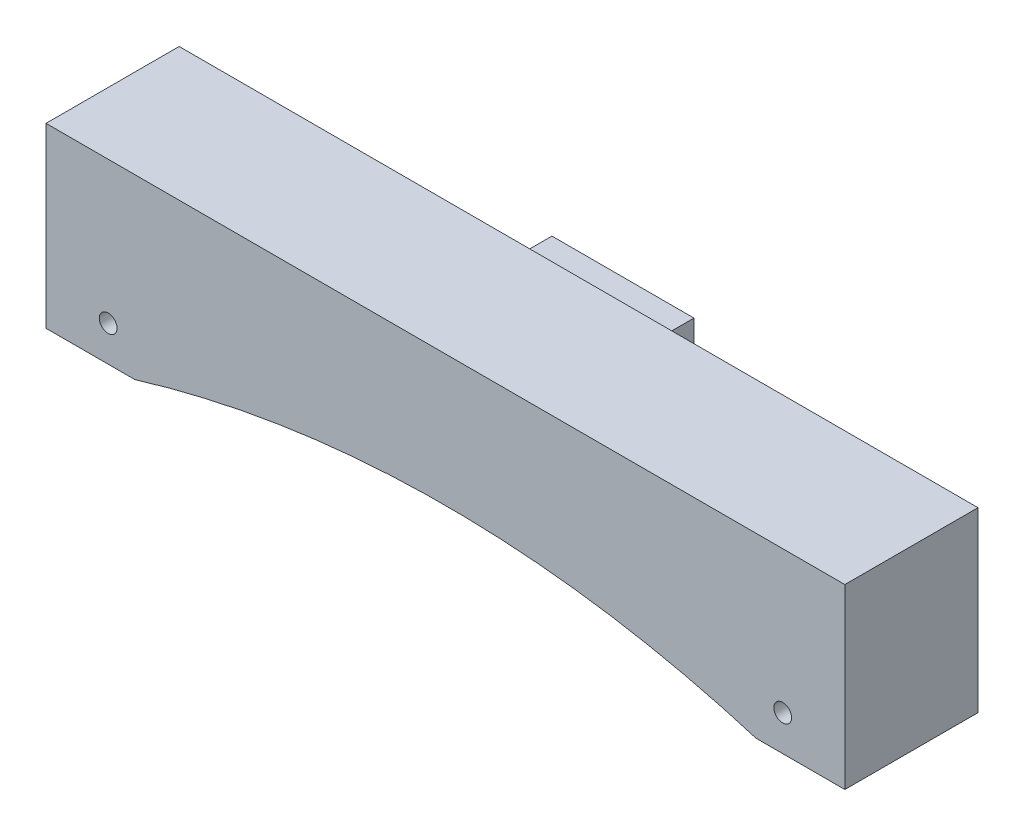
ISO-10303-21;
HEADER;
FILE_DESCRIPTION(('STEP AP214'),'2;1');
FILE_NAME('part.step','',(''),(''),'','','');
FILE_SCHEMA(('AUTOMOTIVE_DESIGN { 1 0 10303 214 1 1 1 1 }'));
ENDSEC;
DATA;
#1=APPLICATION_CONTEXT('core data for automotive mechanical design processes');
#2=APPLICATION_PROTOCOL_DEFINITION('international standard','automotive_design',2000,#1);
#3=PRODUCT_CONTEXT('',#1,'mechanical');
#4=PRODUCT('Part','Part','',(#3));
#5=PRODUCT_RELATED_PRODUCT_CATEGORY('part','',(#4));
#6=PRODUCT_DEFINITION_FORMATION('','',#4);
#7=PRODUCT_DEFINITION_CONTEXT('part definition',#1,'design');
#8=PRODUCT_DEFINITION('design','',#6,#7);
#9=PRODUCT_DEFINITION_SHAPE('','',#8);
#10=(LENGTH_UNIT() NAMED_UNIT(*) SI_UNIT(.MILLI.,.METRE.));
#11=(NAMED_UNIT(*) PLANE_ANGLE_UNIT() SI_UNIT($,.RADIAN.));
#12=(NAMED_UNIT(*) SI_UNIT($,.STERADIAN.) SOLID_ANGLE_UNIT());
#13=UNCERTAINTY_MEASURE_WITH_UNIT(LENGTH_MEASURE(1.E-05),#10,'distance_accuracy_value','');
#14=(GEOMETRIC_REPRESENTATION_CONTEXT(3) GLOBAL_UNCERTAINTY_ASSIGNED_CONTEXT((#13)) GLOBAL_UNIT_ASSIGNED_CONTEXT((#10,
#11,#12)) REPRESENTATION_CONTEXT('',''));
#15=CARTESIAN_POINT('',(0.,0.,0.));
#16=DIRECTION('',(0.,0.,1.));
#17=DIRECTION('',(1.,0.,0.));
#18=AXIS2_PLACEMENT_3D('',#15,#16,#17);
#19=CARTESIAN_POINT('',(45.,-134.78240283249,0.));
#20=DIRECTION('',(0.,0.,1.));
#21=DIRECTION('',(1.,0.,0.));
#22=AXIS2_PLACEMENT_3D('',#19,#20,#21);
#23=PLANE('',#22);
#24=DIRECTION('',(0.,-1.,0.));
#25=VECTOR('',#24,1.);
#26=CARTESIAN_POINT('',(0.,0.,0.));
#27=LINE('',#26,#25);
#28=CARTESIAN_POINT('',(0.,0.,0.));
#29=VERTEX_POINT('',#28);
#30=CARTESIAN_POINT('',(0.,-20.,0.));
#31=VERTEX_POINT('',#30);
#32=EDGE_CURVE('E243',#29,#31,#27,.T.);
#33=ORIENTED_EDGE('',*,*,#32,.F.);
#34=DIRECTION('',(-1.,0.,0.));
#35=VECTOR('',#34,1.);
#36=CARTESIAN_POINT('',(0.,0.,0.));
#37=LINE('',#36,#35);
#38=CARTESIAN_POINT('',(90.,0.,0.));
#39=VERTEX_POINT('',#38);
#40=EDGE_CURVE('E260',#39,#29,#37,.T.);
#41=ORIENTED_EDGE('',*,*,#40,.F.);
#42=DIRECTION('',(0.,1.,0.));
#43=VECTOR('',#42,1.);
#44=CARTESIAN_POINT('',(90.,0.,0.));
#45=LINE('',#44,#43);
#46=CARTESIAN_POINT('',(90.,-20.,0.));
#47=VERTEX_POINT('',#46);
#48=EDGE_CURVE('E288',#47,#39,#45,.T.);
#49=ORIENTED_EDGE('',*,*,#48,.F.);
#50=DIRECTION('',(1.,0.,0.));
#51=VECTOR('',#50,1.);
#52=CARTESIAN_POINT('',(90.,-20.,0.));
#53=LINE('',#52,#51);
#54=CARTESIAN_POINT('',(80.,-20.,0.));
#55=VERTEX_POINT('',#54);
#56=EDGE_CURVE('E285',#55,#47,#53,.T.);
#57=ORIENTED_EDGE('',*,*,#56,.F.);
#58=CARTESIAN_POINT('',(45.,-134.78240283249,0.));
#59=DIRECTION('',(0.,0.,-1.));
#60=DIRECTION('',(1.,0.,0.));
#61=AXIS2_PLACEMENT_3D('',#58,#59,#60);
#62=CIRCLE('',#61,120.);
#63=CARTESIAN_POINT('',(10.,-20.,0.));
#64=VERTEX_POINT('',#63);
#65=EDGE_CURVE('E282',#64,#55,#62,.T.);
#66=ORIENTED_EDGE('',*,*,#65,.F.);
#67=DIRECTION('',(1.,0.,0.));
#68=VECTOR('',#67,1.);
#69=CARTESIAN_POINT('',(0.,-20.,0.));
#70=LINE('',#69,#68);
#71=EDGE_CURVE('E279',#31,#64,#70,.T.);
#72=ORIENTED_EDGE('',*,*,#71,.F.);
#73=EDGE_LOOP('',(#33,#41,#49,#57,#66,#72));
#74=FACE_BOUND('',#73,.T.);
#75=DIRECTION('',(0.,1.,0.));
#76=VECTOR('',#75,1.);
#77=CARTESIAN_POINT('',(37.,-11.5,0.));
#78=LINE('',#77,#76);
#79=CARTESIAN_POINT('',(37.,-11.5,0.));
#80=VERTEX_POINT('',#79);
#81=CARTESIAN_POINT('',(37.,-2.5,0.));
#82=VERTEX_POINT('',#81);
#83=EDGE_CURVE('E57',#80,#82,#78,.T.);
#84=ORIENTED_EDGE('',*,*,#83,.F.);
#85=DIRECTION('',(-1.,0.,0.));
#86=VECTOR('',#85,1.);
#87=CARTESIAN_POINT('',(53.,-11.5,0.));
#88=LINE('',#87,#86);
#89=CARTESIAN_POINT('',(53.,-11.5,0.));
#90=VERTEX_POINT('',#89);
#91=EDGE_CURVE('E61',#90,#80,#88,.T.);
#92=ORIENTED_EDGE('',*,*,#91,.F.);
#93=DIRECTION('',(0.,-1.,0.));
#94=VECTOR('',#93,1.);
#95=CARTESIAN_POINT('',(53.,-11.5,0.));
#96=LINE('',#95,#94);
#97=CARTESIAN_POINT('',(53.,-2.5,0.));
#98=VERTEX_POINT('',#97);
#99=EDGE_CURVE('E218',#98,#90,#96,.T.);
#100=ORIENTED_EDGE('',*,*,#99,.F.);
#101=DIRECTION('',(1.,0.,0.));
#102=VECTOR('',#101,1.);
#103=CARTESIAN_POINT('',(53.,-2.5,0.));
#104=LINE('',#103,#102);
#105=EDGE_CURVE('E214',#82,#98,#104,.T.);
#106=ORIENTED_EDGE('',*,*,#105,.F.);
#107=EDGE_LOOP('',(#84,#92,#100,#106));
#108=FACE_BOUND('',#107,.T.);
#109=ADVANCED_FACE('F41',(#74,#108),#23,.F.);
#110=CARTESIAN_POINT('',(0.,0.,15.));
#111=DIRECTION('',(1.,0.,0.));
#112=DIRECTION('',(0.,1.,0.));
#113=AXIS2_PLACEMENT_3D('',#110,#111,#112);
#114=PLANE('',#113);
#115=ORIENTED_EDGE('',*,*,#32,.T.);
#116=DIRECTION('',(0.,0.,-1.));
#117=VECTOR('',#116,1.);
#118=CARTESIAN_POINT('',(0.,-20.,15.));
#119=LINE('',#118,#117);
#120=CARTESIAN_POINT('',(0.,-20.,15.));
#121=VERTEX_POINT('',#120);
#122=EDGE_CURVE('E11',#121,#31,#119,.T.);
#123=ORIENTED_EDGE('',*,*,#122,.F.);
#124=DIRECTION('',(0.,-1.,0.));
#125=VECTOR('',#124,1.);
#126=CARTESIAN_POINT('',(0.,0.,15.));
#127=LINE('',#126,#125);
#128=CARTESIAN_POINT('',(0.,0.,15.));
#129=VERTEX_POINT('',#128);
#130=EDGE_CURVE('E255',#129,#121,#127,.T.);
#131=ORIENTED_EDGE('',*,*,#130,.F.);
#132=DIRECTION('',(0.,0.,-1.));
#133=VECTOR('',#132,1.);
#134=CARTESIAN_POINT('',(0.,0.,15.));
#135=LINE('',#134,#133);
#136=EDGE_CURVE('E275',#129,#29,#135,.T.);
#137=ORIENTED_EDGE('',*,*,#136,.T.);
#138=EDGE_LOOP('',(#115,#123,#131,#137));
#139=FACE_BOUND('',#138,.T.);
#140=ADVANCED_FACE('F43',(#139),#114,.F.);
#141=CARTESIAN_POINT('',(0.,-20.,15.));
#142=DIRECTION('',(0.,1.,0.));
#143=DIRECTION('',(0.,0.,1.));
#144=AXIS2_PLACEMENT_3D('',#141,#142,#143);
#145=PLANE('',#144);
#146=ORIENTED_EDGE('',*,*,#71,.T.);
#147=DIRECTION('',(0.,0.,-1.));
#148=VECTOR('',#147,1.);
#149=CARTESIAN_POINT('',(10.,-20.,15.));
#150=LINE('',#149,#148);
#151=CARTESIAN_POINT('',(10.,-20.,15.));
#152=VERTEX_POINT('',#151);
#153=EDGE_CURVE('E50',#152,#64,#150,.T.);
#154=ORIENTED_EDGE('',*,*,#153,.F.);
#155=DIRECTION('',(1.,0.,0.));
#156=VECTOR('',#155,1.);
#157=CARTESIAN_POINT('',(0.,-20.,15.));
#158=LINE('',#157,#156);
#159=EDGE_CURVE('E259',#121,#152,#158,.T.);
#160=ORIENTED_EDGE('',*,*,#159,.F.);
#161=ORIENTED_EDGE('',*,*,#122,.T.);
#162=EDGE_LOOP('',(#146,#154,#160,#161));
#163=FACE_BOUND('',#162,.T.);
#164=ADVANCED_FACE('F335',(#163),#145,.F.);
#165=CARTESIAN_POINT('',(45.,-134.78240283249,15.));
#166=DIRECTION('',(0.,0.,-1.));
#167=DIRECTION('',(-1.,0.,0.));
#168=AXIS2_PLACEMENT_3D('',#165,#166,#167);
#169=CYLINDRICAL_SURFACE('',#168,120.);
#170=ORIENTED_EDGE('',*,*,#65,.T.);
#171=DIRECTION('',(0.,0.,-1.));
#172=VECTOR('',#171,1.);
#173=CARTESIAN_POINT('',(80.,-20.,15.));
#174=LINE('',#173,#172);
#175=CARTESIAN_POINT('',(80.,-20.,15.));
#176=VERTEX_POINT('',#175);
#177=EDGE_CURVE('E304',#176,#55,#174,.T.);
#178=ORIENTED_EDGE('',*,*,#177,.F.);
#179=CARTESIAN_POINT('',(45.,-134.78240283249,15.));
#180=DIRECTION('',(0.,0.,-1.));
#181=DIRECTION('',(1.,0.,0.));
#182=AXIS2_PLACEMENT_3D('',#179,#180,#181);
#183=CIRCLE('',#182,120.);
#184=EDGE_CURVE('E263',#152,#176,#183,.T.);
#185=ORIENTED_EDGE('',*,*,#184,.F.);
#186=ORIENTED_EDGE('',*,*,#153,.T.);
#187=EDGE_LOOP('',(#170,#178,#185,#186));
#188=FACE_BOUND('',#187,.T.);
#189=ADVANCED_FACE('F313',(#188),#169,.F.);
#190=CARTESIAN_POINT('',(90.,-20.,15.));
#191=DIRECTION('',(0.,1.,0.));
#192=DIRECTION('',(-1.,0.,0.));
#193=AXIS2_PLACEMENT_3D('',#190,#191,#192);
#194=PLANE('',#193);
#195=ORIENTED_EDGE('',*,*,#56,.T.);
#196=DIRECTION('',(0.,0.,-1.));
#197=VECTOR('',#196,1.);
#198=CARTESIAN_POINT('',(90.,-20.,15.));
#199=LINE('',#198,#197);
#200=CARTESIAN_POINT('',(90.,-20.,15.));
#201=VERTEX_POINT('',#200);
#202=EDGE_CURVE('E300',#201,#47,#199,.T.);
#203=ORIENTED_EDGE('',*,*,#202,.F.);
#204=DIRECTION('',(1.,0.,0.));
#205=VECTOR('',#204,1.);
#206=CARTESIAN_POINT('',(90.,-20.,15.));
#207=LINE('',#206,#205);
#208=EDGE_CURVE('E266',#176,#201,#207,.T.);
#209=ORIENTED_EDGE('',*,*,#208,.F.);
#210=ORIENTED_EDGE('',*,*,#177,.T.);
#211=EDGE_LOOP('',(#195,#203,#209,#210));
#212=FACE_BOUND('',#211,.T.);
#213=ADVANCED_FACE('F323',(#212),#194,.F.);
#214=CARTESIAN_POINT('',(90.,0.,15.));
#215=DIRECTION('',(-1.,0.,0.));
#216=DIRECTION('',(0.,0.,1.));
#217=AXIS2_PLACEMENT_3D('',#214,#215,#216);
#218=PLANE('',#217);
#219=ORIENTED_EDGE('',*,*,#48,.T.);
#220=DIRECTION('',(0.,0.,-1.));
#221=VECTOR('',#220,1.);
#222=CARTESIAN_POINT('',(90.,0.,15.));
#223=LINE('',#222,#221);
#224=CARTESIAN_POINT('',(90.,0.,15.));
#225=VERTEX_POINT('',#224);
#226=EDGE_CURVE('E296',#225,#39,#223,.T.);
#227=ORIENTED_EDGE('',*,*,#226,.F.);
#228=DIRECTION('',(0.,1.,0.));
#229=VECTOR('',#228,1.);
#230=CARTESIAN_POINT('',(90.,0.,15.));
#231=LINE('',#230,#229);
#232=EDGE_CURVE('E269',#201,#225,#231,.T.);
#233=ORIENTED_EDGE('',*,*,#232,.F.);
#234=ORIENTED_EDGE('',*,*,#202,.T.);
#235=EDGE_LOOP('',(#219,#227,#233,#234));
#236=FACE_BOUND('',#235,.T.);
#237=ADVANCED_FACE('F327',(#236),#218,.F.);
#238=CARTESIAN_POINT('',(0.,0.,15.));
#239=DIRECTION('',(0.,-1.,0.));
#240=DIRECTION('',(0.,0.,-1.));
#241=AXIS2_PLACEMENT_3D('',#238,#239,#240);
#242=PLANE('',#241);
#243=ORIENTED_EDGE('',*,*,#40,.T.);
#244=ORIENTED_EDGE('',*,*,#136,.F.);
#245=DIRECTION('',(-1.,0.,0.));
#246=VECTOR('',#245,1.);
#247=CARTESIAN_POINT('',(0.,0.,15.));
#248=LINE('',#247,#246);
#249=EDGE_CURVE('E272',#225,#129,#248,.T.);
#250=ORIENTED_EDGE('',*,*,#249,.F.);
#251=ORIENTED_EDGE('',*,*,#226,.T.);
#252=EDGE_LOOP('',(#243,#244,#250,#251));
#253=FACE_BOUND('',#252,.T.);
#254=ADVANCED_FACE('F338',(#253),#242,.F.);
#255=CARTESIAN_POINT('',(45.,-134.78240283249,15.));
#256=DIRECTION('',(0.,0.,1.));
#257=DIRECTION('',(1.,0.,0.));
#258=AXIS2_PLACEMENT_3D('',#255,#256,#257);
#259=PLANE('',#258);
#260=CARTESIAN_POINT('',(7.,-16.,15.));
#261=DIRECTION('',(0.,0.,1.));
#262=DIRECTION('',(1.,0.,0.));
#263=AXIS2_PLACEMENT_3D('',#260,#261,#262);
#264=CIRCLE('',#263,1.);
#265=CARTESIAN_POINT('',(8.,-16.,15.));
#266=VERTEX_POINT('',#265);
#267=EDGE_CURVE('E244',#266,#266,#264,.T.);
#268=ORIENTED_EDGE('',*,*,#267,.F.);
#269=EDGE_LOOP('',(#268));
#270=FACE_BOUND('',#269,.T.);
#271=CARTESIAN_POINT('',(83.,-16.,15.));
#272=DIRECTION('',(0.,0.,1.));
#273=DIRECTION('',(1.,0.,0.));
#274=AXIS2_PLACEMENT_3D('',#271,#272,#273);
#275=CIRCLE('',#274,0.999999999999998);
#276=CARTESIAN_POINT('',(84.,-16.,15.));
#277=VERTEX_POINT('',#276);
#278=EDGE_CURVE('E238',#277,#277,#275,.T.);
#279=ORIENTED_EDGE('',*,*,#278,.F.);
#280=EDGE_LOOP('',(#279));
#281=FACE_BOUND('',#280,.T.);
#282=ORIENTED_EDGE('',*,*,#130,.T.);
#283=ORIENTED_EDGE('',*,*,#159,.T.);
#284=ORIENTED_EDGE('',*,*,#184,.T.);
#285=ORIENTED_EDGE('',*,*,#208,.T.);
#286=ORIENTED_EDGE('',*,*,#232,.T.);
#287=ORIENTED_EDGE('',*,*,#249,.T.);
#288=EDGE_LOOP('',(#282,#283,#284,#285,#286,#287));
#289=FACE_BOUND('',#288,.T.);
#290=ADVANCED_FACE('F331',(#270,#281,#289),#259,.T.);
#291=CARTESIAN_POINT('',(83.,-16.,10.));
#292=DIRECTION('',(0.,0.,1.));
#293=DIRECTION('',(1.,0.,0.));
#294=AXIS2_PLACEMENT_3D('',#291,#292,#293);
#295=CYLINDRICAL_SURFACE('',#294,0.999999999999998);
#296=CARTESIAN_POINT('',(83.,-16.,10.));
#297=DIRECTION('',(0.,0.,1.));
#298=DIRECTION('',(1.,0.,0.));
#299=AXIS2_PLACEMENT_3D('',#296,#297,#298);
#300=CIRCLE('',#299,0.999999999999998);
#301=CARTESIAN_POINT('',(84.,-16.,10.));
#302=VERTEX_POINT('',#301);
#303=EDGE_CURVE('E248',#302,#302,#300,.T.);
#304=ORIENTED_EDGE('',*,*,#303,.F.);
#305=EDGE_LOOP('',(#304));
#306=FACE_BOUND('',#305,.T.);
#307=ORIENTED_EDGE('',*,*,#278,.T.);
#308=EDGE_LOOP('',(#307));
#309=FACE_BOUND('',#308,.T.);
#310=ADVANCED_FACE('F345',(#306,#309),#295,.F.);
#311=CARTESIAN_POINT('',(83.,-16.,10.));
#312=DIRECTION('',(0.,0.,1.));
#313=DIRECTION('',(1.,0.,0.));
#314=AXIS2_PLACEMENT_3D('',#311,#312,#313);
#315=PLANE('',#314);
#316=ORIENTED_EDGE('',*,*,#303,.T.);
#317=EDGE_LOOP('',(#316));
#318=FACE_BOUND('',#317,.T.);
#319=ADVANCED_FACE('F410',(#318),#315,.T.);
#320=CARTESIAN_POINT('',(7.,-16.,10.));
#321=DIRECTION('',(0.,0.,1.));
#322=DIRECTION('',(1.,0.,0.));
#323=AXIS2_PLACEMENT_3D('',#320,#321,#322);
#324=CYLINDRICAL_SURFACE('',#323,1.);
#325=CARTESIAN_POINT('',(7.,-16.,10.));
#326=DIRECTION('',(0.,0.,1.));
#327=DIRECTION('',(1.,0.,0.));
#328=AXIS2_PLACEMENT_3D('',#325,#326,#327);
#329=CIRCLE('',#328,1.);
#330=CARTESIAN_POINT('',(8.,-16.,10.));
#331=VERTEX_POINT('',#330);
#332=EDGE_CURVE('E239',#331,#331,#329,.T.);
#333=ORIENTED_EDGE('',*,*,#332,.F.);
#334=EDGE_LOOP('',(#333));
#335=FACE_BOUND('',#334,.T.);
#336=ORIENTED_EDGE('',*,*,#267,.T.);
#337=EDGE_LOOP('',(#336));
#338=FACE_BOUND('',#337,.T.);
#339=ADVANCED_FACE('F406',(#335,#338),#324,.F.);
#340=CARTESIAN_POINT('',(7.,-16.,10.));
#341=DIRECTION('',(0.,0.,1.));
#342=DIRECTION('',(1.,0.,0.));
#343=AXIS2_PLACEMENT_3D('',#340,#341,#342);
#344=PLANE('',#343);
#345=ORIENTED_EDGE('',*,*,#332,.T.);
#346=EDGE_LOOP('',(#345));
#347=FACE_BOUND('',#346,.T.);
#348=ADVANCED_FACE('F388',(#347),#344,.T.);
#349=CARTESIAN_POINT('',(0.,0.,-5.));
#350=DIRECTION('',(0.,0.,1.));
#351=DIRECTION('',(1.,0.,0.));
#352=AXIS2_PLACEMENT_3D('',#349,#350,#351);
#353=PLANE('',#352);
#354=DIRECTION('',(0.,1.,0.));
#355=VECTOR('',#354,1.);
#356=CARTESIAN_POINT('',(37.,-11.5,-5.));
#357=LINE('',#356,#355);
#358=CARTESIAN_POINT('',(37.,-11.5,-5.));
#359=VERTEX_POINT('',#358);
#360=CARTESIAN_POINT('',(37.,-2.5,-5.));
#361=VERTEX_POINT('',#360);
#362=EDGE_CURVE('E198',#359,#361,#357,.T.);
#363=ORIENTED_EDGE('',*,*,#362,.T.);
#364=DIRECTION('',(1.,0.,0.));
#365=VECTOR('',#364,1.);
#366=CARTESIAN_POINT('',(53.,-2.5,-5.));
#367=LINE('',#366,#365);
#368=CARTESIAN_POINT('',(53.,-2.5,-5.));
#369=VERTEX_POINT('',#368);
#370=EDGE_CURVE('E202',#361,#369,#367,.T.);
#371=ORIENTED_EDGE('',*,*,#370,.T.);
#372=DIRECTION('',(0.,-1.,0.));
#373=VECTOR('',#372,1.);
#374=CARTESIAN_POINT('',(53.,-11.5,-5.));
#375=LINE('',#374,#373);
#376=CARTESIAN_POINT('',(53.,-11.5,-5.));
#377=VERTEX_POINT('',#376);
#378=EDGE_CURVE('E205',#369,#377,#375,.T.);
#379=ORIENTED_EDGE('',*,*,#378,.T.);
#380=DIRECTION('',(-1.,0.,0.));
#381=VECTOR('',#380,1.);
#382=CARTESIAN_POINT('',(53.,-11.5,-5.));
#383=LINE('',#382,#381);
#384=EDGE_CURVE('E208',#377,#359,#383,.T.);
#385=ORIENTED_EDGE('',*,*,#384,.T.);
#386=EDGE_LOOP('',(#363,#371,#379,#385));
#387=FACE_BOUND('',#386,.T.);
#388=DIRECTION('',(0.,1.,0.));
#389=VECTOR('',#388,1.);
#390=CARTESIAN_POINT('',(37.5,-3.,-5.));
#391=LINE('',#390,#389);
#392=CARTESIAN_POINT('',(37.5,-11.,-5.));
#393=VERTEX_POINT('',#392);
#394=CARTESIAN_POINT('',(37.5,-3.,-5.));
#395=VERTEX_POINT('',#394);
#396=EDGE_CURVE('E142',#393,#395,#391,.T.);
#397=ORIENTED_EDGE('',*,*,#396,.F.);
#398=DIRECTION('',(-1.,0.,0.));
#399=VECTOR('',#398,1.);
#400=CARTESIAN_POINT('',(52.5,-11.,-5.));
#401=LINE('',#400,#399);
#402=CARTESIAN_POINT('',(52.5,-11.,-5.));
#403=VERTEX_POINT('',#402);
#404=EDGE_CURVE('E171',#403,#393,#401,.T.);
#405=ORIENTED_EDGE('',*,*,#404,.F.);
#406=DIRECTION('',(0.,-1.,0.));
#407=VECTOR('',#406,1.);
#408=CARTESIAN_POINT('',(52.5,-3.,-5.));
#409=LINE('',#408,#407);
#410=CARTESIAN_POINT('',(52.5,-3.,-5.));
#411=VERTEX_POINT('',#410);
#412=EDGE_CURVE('E167',#411,#403,#409,.T.);
#413=ORIENTED_EDGE('',*,*,#412,.F.);
#414=DIRECTION('',(1.,0.,0.));
#415=VECTOR('',#414,1.);
#416=CARTESIAN_POINT('',(52.5,-3.,-5.));
#417=LINE('',#416,#415);
#418=EDGE_CURVE('E153',#395,#411,#417,.T.);
#419=ORIENTED_EDGE('',*,*,#418,.F.);
#420=EDGE_LOOP('',(#397,#405,#413,#419));
#421=FACE_BOUND('',#420,.T.);
#422=ADVANCED_FACE('F165',(#387,#421),#353,.F.);
#423=CARTESIAN_POINT('',(37.,-11.5,-5.));
#424=DIRECTION('',(1.,0.,0.));
#425=DIRECTION('',(0.,1.,0.));
#426=AXIS2_PLACEMENT_3D('',#423,#424,#425);
#427=PLANE('',#426);
#428=ORIENTED_EDGE('',*,*,#83,.T.);
#429=DIRECTION('',(0.,0.,1.));
#430=VECTOR('',#429,1.);
#431=CARTESIAN_POINT('',(37.,-2.5,-5.));
#432=LINE('',#431,#430);
#433=EDGE_CURVE('E234',#361,#82,#432,.T.);
#434=ORIENTED_EDGE('',*,*,#433,.F.);
#435=ORIENTED_EDGE('',*,*,#362,.F.);
#436=DIRECTION('',(0.,0.,1.));
#437=VECTOR('',#436,1.);
#438=CARTESIAN_POINT('',(37.,-11.5,-5.));
#439=LINE('',#438,#437);
#440=EDGE_CURVE('E211',#359,#80,#439,.T.);
#441=ORIENTED_EDGE('',*,*,#440,.T.);
#442=EDGE_LOOP('',(#428,#434,#435,#441));
#443=FACE_BOUND('',#442,.T.);
#444=ADVANCED_FACE('F387',(#443),#427,.F.);
#445=CARTESIAN_POINT('',(53.,-2.5,-5.));
#446=DIRECTION('',(0.,-1.,0.));
#447=DIRECTION('',(0.,0.,-1.));
#448=AXIS2_PLACEMENT_3D('',#445,#446,#447);
#449=PLANE('',#448);
#450=ORIENTED_EDGE('',*,*,#105,.T.);
#451=DIRECTION('',(0.,0.,1.));
#452=VECTOR('',#451,1.);
#453=CARTESIAN_POINT('',(53.,-2.5,-5.));
#454=LINE('',#453,#452);
#455=EDGE_CURVE('E230',#369,#98,#454,.T.);
#456=ORIENTED_EDGE('',*,*,#455,.F.);
#457=ORIENTED_EDGE('',*,*,#370,.F.);
#458=ORIENTED_EDGE('',*,*,#433,.T.);
#459=EDGE_LOOP('',(#450,#456,#457,#458));
#460=FACE_BOUND('',#459,.T.);
#461=ADVANCED_FACE('F396',(#460),#449,.F.);
#462=CARTESIAN_POINT('',(53.,-11.5,-5.));
#463=DIRECTION('',(-1.,0.,0.));
#464=DIRECTION('',(0.,0.,1.));
#465=AXIS2_PLACEMENT_3D('',#462,#463,#464);
#466=PLANE('',#465);
#467=ORIENTED_EDGE('',*,*,#99,.T.);
#468=DIRECTION('',(0.,0.,1.));
#469=VECTOR('',#468,1.);
#470=CARTESIAN_POINT('',(53.,-11.5,-5.));
#471=LINE('',#470,#469);
#472=EDGE_CURVE('E226',#377,#90,#471,.T.);
#473=ORIENTED_EDGE('',*,*,#472,.F.);
#474=ORIENTED_EDGE('',*,*,#378,.F.);
#475=ORIENTED_EDGE('',*,*,#455,.T.);
#476=EDGE_LOOP('',(#467,#473,#474,#475));
#477=FACE_BOUND('',#476,.T.);
#478=ADVANCED_FACE('F392',(#477),#466,.F.);
#479=CARTESIAN_POINT('',(53.,-11.5,-5.));
#480=DIRECTION('',(0.,1.,0.));
#481=DIRECTION('',(0.,0.,1.));
#482=AXIS2_PLACEMENT_3D('',#479,#480,#481);
#483=PLANE('',#482);
#484=ORIENTED_EDGE('',*,*,#91,.T.);
#485=ORIENTED_EDGE('',*,*,#440,.F.);
#486=ORIENTED_EDGE('',*,*,#384,.F.);
#487=ORIENTED_EDGE('',*,*,#472,.T.);
#488=EDGE_LOOP('',(#484,#485,#486,#487));
#489=FACE_BOUND('',#488,.T.);
#490=ADVANCED_FACE('F384',(#489),#483,.F.);
#491=CARTESIAN_POINT('',(37.5,-3.,-5.));
#492=DIRECTION('',(1.,0.,0.));
#493=DIRECTION('',(0.,0.,-1.));
#494=AXIS2_PLACEMENT_3D('',#491,#492,#493);
#495=PLANE('',#494);
#496=DIRECTION('',(0.,1.,0.));
#497=VECTOR('',#496,1.);
#498=CARTESIAN_POINT('',(37.5,-3.,0.));
#499=LINE('',#498,#497);
#500=CARTESIAN_POINT('',(37.5,-11.,0.));
#501=VERTEX_POINT('',#500);
#502=CARTESIAN_POINT('',(37.5,-3.,0.));
#503=VERTEX_POINT('',#502);
#504=EDGE_CURVE('E177',#501,#503,#499,.T.);
#505=ORIENTED_EDGE('',*,*,#504,.F.);
#506=DIRECTION('',(0.,0.,1.));
#507=VECTOR('',#506,1.);
#508=CARTESIAN_POINT('',(37.5,-11.,-5.));
#509=LINE('',#508,#507);
#510=EDGE_CURVE('E148',#393,#501,#509,.T.);
#511=ORIENTED_EDGE('',*,*,#510,.F.);
#512=ORIENTED_EDGE('',*,*,#396,.T.);
#513=DIRECTION('',(0.,0.,1.));
#514=VECTOR('',#513,1.);
#515=CARTESIAN_POINT('',(37.5,-3.,-5.));
#516=LINE('',#515,#514);
#517=EDGE_CURVE('E145',#395,#503,#516,.T.);
#518=ORIENTED_EDGE('',*,*,#517,.T.);
#519=EDGE_LOOP('',(#505,#511,#512,#518));
#520=FACE_BOUND('',#519,.T.);
#521=ADVANCED_FACE('F144',(#520),#495,.T.);
#522=CARTESIAN_POINT('',(52.5,-3.,-5.));
#523=DIRECTION('',(0.,-1.,0.));
#524=DIRECTION('',(0.,0.,-1.));
#525=AXIS2_PLACEMENT_3D('',#522,#523,#524);
#526=PLANE('',#525);
#527=DIRECTION('',(1.,0.,0.));
#528=VECTOR('',#527,1.);
#529=CARTESIAN_POINT('',(52.5,-3.,0.));
#530=LINE('',#529,#528);
#531=CARTESIAN_POINT('',(52.5,-3.,0.));
#532=VERTEX_POINT('',#531);
#533=EDGE_CURVE('E160',#503,#532,#530,.T.);
#534=ORIENTED_EDGE('',*,*,#533,.F.);
#535=ORIENTED_EDGE('',*,*,#517,.F.);
#536=ORIENTED_EDGE('',*,*,#418,.T.);
#537=DIRECTION('',(0.,0.,1.));
#538=VECTOR('',#537,1.);
#539=CARTESIAN_POINT('',(52.5,-3.,-5.));
#540=LINE('',#539,#538);
#541=EDGE_CURVE('E162',#411,#532,#540,.T.);
#542=ORIENTED_EDGE('',*,*,#541,.T.);
#543=EDGE_LOOP('',(#534,#535,#536,#542));
#544=FACE_BOUND('',#543,.T.);
#545=ADVANCED_FACE('F157',(#544),#526,.T.);
#546=CARTESIAN_POINT('',(52.5,-3.,-5.));
#547=DIRECTION('',(-1.,0.,0.));
#548=DIRECTION('',(0.,0.,1.));
#549=AXIS2_PLACEMENT_3D('',#546,#547,#548);
#550=PLANE('',#549);
#551=DIRECTION('',(0.,-1.,0.));
#552=VECTOR('',#551,1.);
#553=CARTESIAN_POINT('',(52.5,-3.,0.));
#554=LINE('',#553,#552);
#555=CARTESIAN_POINT('',(52.5,-11.,0.));
#556=VERTEX_POINT('',#555);
#557=EDGE_CURVE('E183',#532,#556,#554,.T.);
#558=ORIENTED_EDGE('',*,*,#557,.F.);
#559=ORIENTED_EDGE('',*,*,#541,.F.);
#560=ORIENTED_EDGE('',*,*,#412,.T.);
#561=DIRECTION('',(0.,0.,1.));
#562=VECTOR('',#561,1.);
#563=CARTESIAN_POINT('',(52.5,-11.,-5.));
#564=LINE('',#563,#562);
#565=EDGE_CURVE('E192',#403,#556,#564,.T.);
#566=ORIENTED_EDGE('',*,*,#565,.T.);
#567=EDGE_LOOP('',(#558,#559,#560,#566));
#568=FACE_BOUND('',#567,.T.);
#569=ADVANCED_FACE('F366',(#568),#550,.T.);
#570=CARTESIAN_POINT('',(52.5,-11.,-5.));
#571=DIRECTION('',(0.,1.,0.));
#572=DIRECTION('',(0.,0.,1.));
#573=AXIS2_PLACEMENT_3D('',#570,#571,#572);
#574=PLANE('',#573);
#575=DIRECTION('',(-1.,0.,0.));
#576=VECTOR('',#575,1.);
#577=CARTESIAN_POINT('',(52.5,-11.,0.));
#578=LINE('',#577,#576);
#579=EDGE_CURVE('E154',#556,#501,#578,.T.);
#580=ORIENTED_EDGE('',*,*,#579,.F.);
#581=ORIENTED_EDGE('',*,*,#565,.F.);
#582=ORIENTED_EDGE('',*,*,#404,.T.);
#583=ORIENTED_EDGE('',*,*,#510,.T.);
#584=EDGE_LOOP('',(#580,#581,#582,#583));
#585=FACE_BOUND('',#584,.T.);
#586=ADVANCED_FACE('F357',(#585),#574,.T.);
#587=CARTESIAN_POINT('',(45.,-7.,0.));
#588=DIRECTION('',(0.,0.,-1.));
#589=DIRECTION('',(-1.,0.,0.));
#590=AXIS2_PLACEMENT_3D('',#587,#588,#589);
#591=CIRCLE('',#590,0.999999999999998);
#592=CARTESIAN_POINT('',(44.,-7.,0.));
#593=VERTEX_POINT('',#592);
#594=EDGE_CURVE('E372',#593,#593,#591,.T.);
#595=ORIENTED_EDGE('',*,*,#594,.F.);
#596=EDGE_LOOP('',(#595));
#597=FACE_BOUND('',#596,.T.);
#598=ORIENTED_EDGE('',*,*,#557,.T.);
#599=ORIENTED_EDGE('',*,*,#579,.T.);
#600=ORIENTED_EDGE('',*,*,#504,.T.);
#601=ORIENTED_EDGE('',*,*,#533,.T.);
#602=EDGE_LOOP('',(#598,#599,#600,#601));
#603=FACE_BOUND('',#602,.T.);
#604=ADVANCED_FACE('F351',(#597,#603),#23,.F.);
#605=CARTESIAN_POINT('',(45.,-7.,5.));
#606=DIRECTION('',(0.,0.,-1.));
#607=DIRECTION('',(-1.,0.,0.));
#608=AXIS2_PLACEMENT_3D('',#605,#606,#607);
#609=CYLINDRICAL_SURFACE('',#608,0.999999999999998);
#610=CARTESIAN_POINT('',(45.,-7.,5.));
#611=DIRECTION('',(0.,0.,-1.));
#612=DIRECTION('',(-1.,0.,0.));
#613=AXIS2_PLACEMENT_3D('',#610,#611,#612);
#614=CIRCLE('',#613,0.999999999999998);
#615=CARTESIAN_POINT('',(44.,-7.,5.));
#616=VERTEX_POINT('',#615);
#617=EDGE_CURVE('E180',#616,#616,#614,.T.);
#618=ORIENTED_EDGE('',*,*,#617,.F.);
#619=EDGE_LOOP('',(#618));
#620=FACE_BOUND('',#619,.T.);
#621=ORIENTED_EDGE('',*,*,#594,.T.);
#622=EDGE_LOOP('',(#621));
#623=FACE_BOUND('',#622,.T.);
#624=ADVANCED_FACE('F356',(#620,#623),#609,.F.);
#625=CARTESIAN_POINT('',(45.,-7.,5.));
#626=DIRECTION('',(0.,0.,-1.));
#627=DIRECTION('',(-1.,0.,0.));
#628=AXIS2_PLACEMENT_3D('',#625,#626,#627);
#629=PLANE('',#628);
#630=ORIENTED_EDGE('',*,*,#617,.T.);
#631=EDGE_LOOP('',(#630));
#632=FACE_BOUND('',#631,.T.);
#633=ADVANCED_FACE('F363',(#632),#629,.T.);
#634=CLOSED_SHELL('',(#109,#140,#164,#189,#213,#237,#254,#290,#310,#319,#339,#348,#422,#444,
#461,#478,#490,#521,#545,#569,#586,#604,#624,#633));
#635=MANIFOLD_SOLID_BREP('B2',#634);
#636=ADVANCED_BREP_SHAPE_REPRESENTATION('',(#18,#635),#14);
#637=SHAPE_DEFINITION_REPRESENTATION(#9,#636);
ENDSEC;
END-ISO-10303-21;
